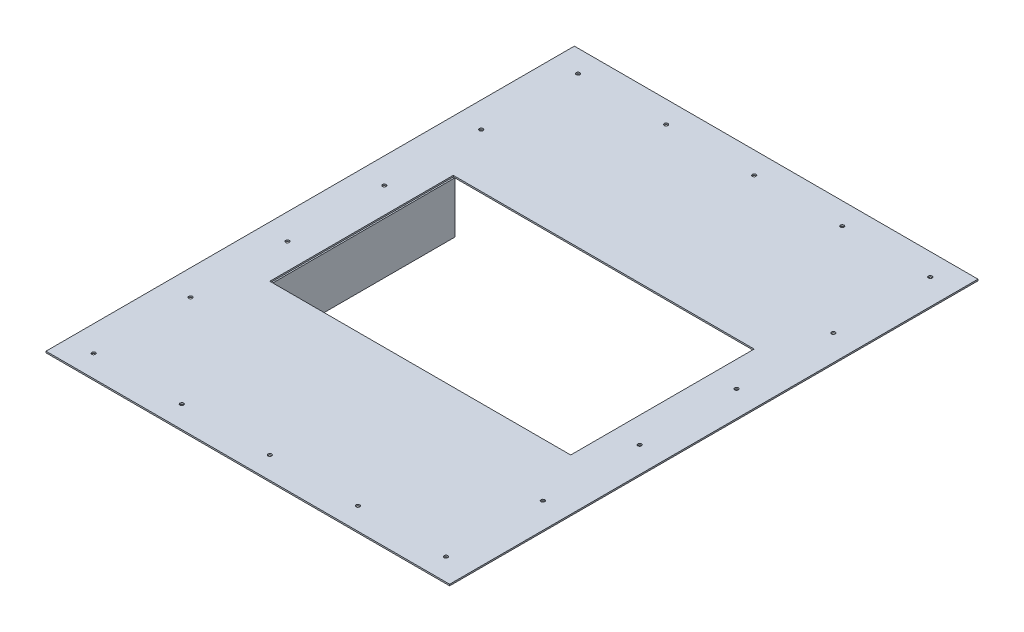
ISO-10303-21;
HEADER;
FILE_DESCRIPTION(('STEP AP214'),'2;1');
FILE_NAME('part.step','',(''),(''),'','','');
FILE_SCHEMA(('AUTOMOTIVE_DESIGN { 1 0 10303 214 1 1 1 1 }'));
ENDSEC;
DATA;
#1=APPLICATION_CONTEXT('core data for automotive mechanical design processes');
#2=APPLICATION_PROTOCOL_DEFINITION('international standard','automotive_design',2000,#1);
#3=PRODUCT_CONTEXT('',#1,'mechanical');
#4=PRODUCT('Part','Part','',(#3));
#5=PRODUCT_RELATED_PRODUCT_CATEGORY('part','',(#4));
#6=PRODUCT_DEFINITION_FORMATION('','',#4);
#7=PRODUCT_DEFINITION_CONTEXT('part definition',#1,'design');
#8=PRODUCT_DEFINITION('design','',#6,#7);
#9=PRODUCT_DEFINITION_SHAPE('','',#8);
#10=(LENGTH_UNIT() NAMED_UNIT(*) SI_UNIT(.MILLI.,.METRE.));
#11=(NAMED_UNIT(*) PLANE_ANGLE_UNIT() SI_UNIT($,.RADIAN.));
#12=(NAMED_UNIT(*) SI_UNIT($,.STERADIAN.) SOLID_ANGLE_UNIT());
#13=UNCERTAINTY_MEASURE_WITH_UNIT(LENGTH_MEASURE(1.E-05),#10,'distance_accuracy_value','');
#14=(GEOMETRIC_REPRESENTATION_CONTEXT(3) GLOBAL_UNCERTAINTY_ASSIGNED_CONTEXT((#13)) GLOBAL_UNIT_ASSIGNED_CONTEXT((#10,
#11,#12)) REPRESENTATION_CONTEXT('',''));
#15=CARTESIAN_POINT('',(0.,0.,0.));
#16=DIRECTION('',(0.,0.,1.));
#17=DIRECTION('',(1.,0.,0.));
#18=AXIS2_PLACEMENT_3D('',#15,#16,#17);
#19=CARTESIAN_POINT('',(478.,0.,235.));
#20=DIRECTION('',(0.,0.,1.));
#21=DIRECTION('',(1.,0.,0.));
#22=AXIS2_PLACEMENT_3D('',#19,#20,#21);
#23=PLANE('',#22);
#24=DIRECTION('',(0.,-1.,0.));
#25=VECTOR('',#24,1.);
#26=CARTESIAN_POINT('',(480.,0.,235.));
#27=LINE('',#26,#25);
#28=CARTESIAN_POINT('',(480.,0.,235.));
#29=VERTEX_POINT('',#28);
#30=CARTESIAN_POINT('',(480.,-70.,235.));
#31=VERTEX_POINT('',#30);
#32=EDGE_CURVE('E105',#29,#31,#27,.T.);
#33=ORIENTED_EDGE('',*,*,#32,.T.);
#34=DIRECTION('',(1.,0.,0.));
#35=VECTOR('',#34,1.);
#36=CARTESIAN_POINT('',(478.,-70.,235.));
#37=LINE('',#36,#35);
#38=CARTESIAN_POINT('',(478.,-70.,235.));
#39=VERTEX_POINT('',#38);
#40=EDGE_CURVE('E12',#39,#31,#37,.T.);
#41=ORIENTED_EDGE('',*,*,#40,.F.);
#42=DIRECTION('',(0.,-1.,0.));
#43=VECTOR('',#42,1.);
#44=CARTESIAN_POINT('',(478.,0.,235.));
#45=LINE('',#44,#43);
#46=CARTESIAN_POINT('',(478.,0.,235.));
#47=VERTEX_POINT('',#46);
#48=EDGE_CURVE('E93',#47,#39,#45,.T.);
#49=ORIENTED_EDGE('',*,*,#48,.F.);
#50=DIRECTION('',(1.,0.,0.));
#51=VECTOR('',#50,1.);
#52=CARTESIAN_POINT('',(478.,0.,235.));
#53=LINE('',#52,#51);
#54=EDGE_CURVE('E101',#47,#29,#53,.T.);
#55=ORIENTED_EDGE('',*,*,#54,.T.);
#56=EDGE_LOOP('',(#33,#41,#49,#55));
#57=FACE_BOUND('',#56,.T.);
#58=ADVANCED_FACE('F42',(#57),#23,.F.);
#59=CARTESIAN_POINT('',(478.,-70.,235.));
#60=DIRECTION('',(0.,1.,0.));
#61=DIRECTION('',(0.,0.,1.));
#62=AXIS2_PLACEMENT_3D('',#59,#60,#61);
#63=PLANE('',#62);
#64=DIRECTION('',(0.,0.,1.));
#65=VECTOR('',#64,1.);
#66=CARTESIAN_POINT('',(480.,-70.,235.));
#67=LINE('',#66,#65);
#68=CARTESIAN_POINT('',(480.,-70.,485.));
#69=VERTEX_POINT('',#68);
#70=EDGE_CURVE('E97',#31,#69,#67,.T.);
#71=ORIENTED_EDGE('',*,*,#70,.T.);
#72=DIRECTION('',(1.,0.,0.));
#73=VECTOR('',#72,1.);
#74=CARTESIAN_POINT('',(478.,-70.,485.));
#75=LINE('',#74,#73);
#76=CARTESIAN_POINT('',(478.,-70.,485.));
#77=VERTEX_POINT('',#76);
#78=EDGE_CURVE('E50',#77,#69,#75,.T.);
#79=ORIENTED_EDGE('',*,*,#78,.F.);
#80=DIRECTION('',(0.,0.,1.));
#81=VECTOR('',#80,1.);
#82=CARTESIAN_POINT('',(478.,-70.,235.));
#83=LINE('',#82,#81);
#84=EDGE_CURVE('E88',#39,#77,#83,.T.);
#85=ORIENTED_EDGE('',*,*,#84,.F.);
#86=ORIENTED_EDGE('',*,*,#40,.T.);
#87=EDGE_LOOP('',(#71,#79,#85,#86));
#88=FACE_BOUND('',#87,.T.);
#89=ADVANCED_FACE('F96',(#88),#63,.F.);
#90=CARTESIAN_POINT('',(478.,0.,485.));
#91=DIRECTION('',(0.,0.,-1.));
#92=DIRECTION('',(-1.,0.,0.));
#93=AXIS2_PLACEMENT_3D('',#90,#91,#92);
#94=PLANE('',#93);
#95=DIRECTION('',(0.,1.,0.));
#96=VECTOR('',#95,1.);
#97=CARTESIAN_POINT('',(480.,0.,485.));
#98=LINE('',#97,#96);
#99=CARTESIAN_POINT('',(480.,0.,485.));
#100=VERTEX_POINT('',#99);
#101=EDGE_CURVE('E75',#69,#100,#98,.T.);
#102=ORIENTED_EDGE('',*,*,#101,.T.);
#103=DIRECTION('',(1.,0.,0.));
#104=VECTOR('',#103,1.);
#105=CARTESIAN_POINT('',(478.,0.,485.));
#106=LINE('',#105,#104);
#107=CARTESIAN_POINT('',(478.,0.,485.));
#108=VERTEX_POINT('',#107);
#109=EDGE_CURVE('E98',#108,#100,#106,.T.);
#110=ORIENTED_EDGE('',*,*,#109,.F.);
#111=DIRECTION('',(0.,1.,0.));
#112=VECTOR('',#111,1.);
#113=CARTESIAN_POINT('',(478.,0.,485.));
#114=LINE('',#113,#112);
#115=EDGE_CURVE('E91',#77,#108,#114,.T.);
#116=ORIENTED_EDGE('',*,*,#115,.F.);
#117=ORIENTED_EDGE('',*,*,#78,.T.);
#118=EDGE_LOOP('',(#102,#110,#116,#117));
#119=FACE_BOUND('',#118,.T.);
#120=ADVANCED_FACE('F99',(#119),#94,.F.);
#121=CARTESIAN_POINT('',(478.,0.,235.));
#122=DIRECTION('',(0.,-1.,0.));
#123=DIRECTION('',(0.,0.,-1.));
#124=AXIS2_PLACEMENT_3D('',#121,#122,#123);
#125=PLANE('',#124);
#126=DIRECTION('',(0.,0.,-1.));
#127=VECTOR('',#126,1.);
#128=CARTESIAN_POINT('',(480.,0.,235.));
#129=LINE('',#128,#127);
#130=EDGE_CURVE('E81',#100,#29,#129,.T.);
#131=ORIENTED_EDGE('',*,*,#130,.T.);
#132=ORIENTED_EDGE('',*,*,#54,.F.);
#133=DIRECTION('',(0.,0.,-1.));
#134=VECTOR('',#133,1.);
#135=CARTESIAN_POINT('',(478.,0.,235.));
#136=LINE('',#135,#134);
#137=EDGE_CURVE('E58',#108,#47,#136,.T.);
#138=ORIENTED_EDGE('',*,*,#137,.F.);
#139=ORIENTED_EDGE('',*,*,#109,.T.);
#140=EDGE_LOOP('',(#131,#132,#138,#139));
#141=FACE_BOUND('',#140,.T.);
#142=ADVANCED_FACE('F112',(#141),#125,.F.);
#143=CARTESIAN_POINT('',(478.,-70.,235.));
#144=DIRECTION('',(-1.,0.,0.));
#145=DIRECTION('',(0.,0.,1.));
#146=AXIS2_PLACEMENT_3D('',#143,#144,#145);
#147=PLANE('',#146);
#148=ORIENTED_EDGE('',*,*,#48,.T.);
#149=ORIENTED_EDGE('',*,*,#84,.T.);
#150=ORIENTED_EDGE('',*,*,#115,.T.);
#151=ORIENTED_EDGE('',*,*,#137,.T.);
#152=EDGE_LOOP('',(#148,#149,#150,#151));
#153=FACE_BOUND('',#152,.T.);
#154=ADVANCED_FACE('F89',(#153),#147,.T.);
#155=CARTESIAN_POINT('',(480.,-70.,235.));
#156=DIRECTION('',(-1.,0.,0.));
#157=DIRECTION('',(0.,0.,1.));
#158=AXIS2_PLACEMENT_3D('',#155,#156,#157);
#159=PLANE('',#158);
#160=ORIENTED_EDGE('',*,*,#32,.F.);
#161=ORIENTED_EDGE('',*,*,#130,.F.);
#162=ORIENTED_EDGE('',*,*,#101,.F.);
#163=ORIENTED_EDGE('',*,*,#70,.F.);
#164=EDGE_LOOP('',(#160,#161,#162,#163));
#165=FACE_BOUND('',#164,.T.);
#166=ADVANCED_FACE('F115',(#165),#159,.F.);
#167=CLOSED_SHELL('',(#58,#89,#120,#142,#154,#166));
#168=MANIFOLD_SOLID_BREP('B2',#167);
#169=CARTESIAN_POINT('',(72.0000000000001,0.,485.));
#170=DIRECTION('',(0.,0.,-1.));
#171=DIRECTION('',(-1.,0.,0.));
#172=AXIS2_PLACEMENT_3D('',#169,#170,#171);
#173=PLANE('',#172);
#174=DIRECTION('',(0.,-1.,0.));
#175=VECTOR('',#174,1.);
#176=CARTESIAN_POINT('',(70.0000000000001,0.,485.));
#177=LINE('',#176,#175);
#178=CARTESIAN_POINT('',(70.0000000000001,0.,485.));
#179=VERTEX_POINT('',#178);
#180=CARTESIAN_POINT('',(70.0000000000001,-70.,485.));
#181=VERTEX_POINT('',#180);
#182=EDGE_CURVE('E238',#179,#181,#177,.T.);
#183=ORIENTED_EDGE('',*,*,#182,.T.);
#184=DIRECTION('',(-1.,0.,0.));
#185=VECTOR('',#184,1.);
#186=CARTESIAN_POINT('',(72.0000000000001,-70.,485.));
#187=LINE('',#186,#185);
#188=CARTESIAN_POINT('',(72.0000000000001,-70.,485.));
#189=VERTEX_POINT('',#188);
#190=EDGE_CURVE('E40',#189,#181,#187,.T.);
#191=ORIENTED_EDGE('',*,*,#190,.F.);
#192=DIRECTION('',(0.,-1.,0.));
#193=VECTOR('',#192,1.);
#194=CARTESIAN_POINT('',(72.0000000000001,0.,485.));
#195=LINE('',#194,#193);
#196=CARTESIAN_POINT('',(72.0000000000001,0.,485.));
#197=VERTEX_POINT('',#196);
#198=EDGE_CURVE('E226',#197,#189,#195,.T.);
#199=ORIENTED_EDGE('',*,*,#198,.F.);
#200=DIRECTION('',(-1.,0.,0.));
#201=VECTOR('',#200,1.);
#202=CARTESIAN_POINT('',(72.0000000000001,0.,485.));
#203=LINE('',#202,#201);
#204=EDGE_CURVE('E234',#197,#179,#203,.T.);
#205=ORIENTED_EDGE('',*,*,#204,.T.);
#206=EDGE_LOOP('',(#183,#191,#199,#205));
#207=FACE_BOUND('',#206,.T.);
#208=ADVANCED_FACE('F175',(#207),#173,.F.);
#209=CARTESIAN_POINT('',(72.0000000000001,-70.,485.));
#210=DIRECTION('',(0.,1.,0.));
#211=DIRECTION('',(0.,0.,1.));
#212=AXIS2_PLACEMENT_3D('',#209,#210,#211);
#213=PLANE('',#212);
#214=DIRECTION('',(0.,0.,-1.));
#215=VECTOR('',#214,1.);
#216=CARTESIAN_POINT('',(70.0000000000001,-70.,485.));
#217=LINE('',#216,#215);
#218=CARTESIAN_POINT('',(70.,-70.,235.));
#219=VERTEX_POINT('',#218);
#220=EDGE_CURVE('E230',#181,#219,#217,.T.);
#221=ORIENTED_EDGE('',*,*,#220,.T.);
#222=DIRECTION('',(-1.,0.,0.));
#223=VECTOR('',#222,1.);
#224=CARTESIAN_POINT('',(72.0000000000001,-70.,235.));
#225=LINE('',#224,#223);
#226=CARTESIAN_POINT('',(72.0000000000001,-70.,235.));
#227=VERTEX_POINT('',#226);
#228=EDGE_CURVE('E183',#227,#219,#225,.T.);
#229=ORIENTED_EDGE('',*,*,#228,.F.);
#230=DIRECTION('',(0.,0.,-1.));
#231=VECTOR('',#230,1.);
#232=CARTESIAN_POINT('',(72.0000000000001,-70.,485.));
#233=LINE('',#232,#231);
#234=EDGE_CURVE('E221',#189,#227,#233,.T.);
#235=ORIENTED_EDGE('',*,*,#234,.F.);
#236=ORIENTED_EDGE('',*,*,#190,.T.);
#237=EDGE_LOOP('',(#221,#229,#235,#236));
#238=FACE_BOUND('',#237,.T.);
#239=ADVANCED_FACE('F229',(#238),#213,.F.);
#240=CARTESIAN_POINT('',(72.0000000000001,0.,235.));
#241=DIRECTION('',(0.,0.,1.));
#242=DIRECTION('',(1.,0.,0.));
#243=AXIS2_PLACEMENT_3D('',#240,#241,#242);
#244=PLANE('',#243);
#245=DIRECTION('',(0.,1.,0.));
#246=VECTOR('',#245,1.);
#247=CARTESIAN_POINT('',(70.,0.,235.));
#248=LINE('',#247,#246);
#249=CARTESIAN_POINT('',(70.,0.,235.));
#250=VERTEX_POINT('',#249);
#251=EDGE_CURVE('E208',#219,#250,#248,.T.);
#252=ORIENTED_EDGE('',*,*,#251,.T.);
#253=DIRECTION('',(-1.,0.,0.));
#254=VECTOR('',#253,1.);
#255=CARTESIAN_POINT('',(72.0000000000001,0.,235.));
#256=LINE('',#255,#254);
#257=CARTESIAN_POINT('',(72.0000000000001,0.,235.));
#258=VERTEX_POINT('',#257);
#259=EDGE_CURVE('E231',#258,#250,#256,.T.);
#260=ORIENTED_EDGE('',*,*,#259,.F.);
#261=DIRECTION('',(0.,1.,0.));
#262=VECTOR('',#261,1.);
#263=CARTESIAN_POINT('',(72.0000000000001,0.,235.));
#264=LINE('',#263,#262);
#265=EDGE_CURVE('E224',#227,#258,#264,.T.);
#266=ORIENTED_EDGE('',*,*,#265,.F.);
#267=ORIENTED_EDGE('',*,*,#228,.T.);
#268=EDGE_LOOP('',(#252,#260,#266,#267));
#269=FACE_BOUND('',#268,.T.);
#270=ADVANCED_FACE('F232',(#269),#244,.F.);
#271=CARTESIAN_POINT('',(72.0000000000001,0.,485.));
#272=DIRECTION('',(0.,-1.,0.));
#273=DIRECTION('',(0.,0.,-1.));
#274=AXIS2_PLACEMENT_3D('',#271,#272,#273);
#275=PLANE('',#274);
#276=DIRECTION('',(0.,0.,1.));
#277=VECTOR('',#276,1.);
#278=CARTESIAN_POINT('',(70.0000000000001,0.,485.));
#279=LINE('',#278,#277);
#280=EDGE_CURVE('E214',#250,#179,#279,.T.);
#281=ORIENTED_EDGE('',*,*,#280,.T.);
#282=ORIENTED_EDGE('',*,*,#204,.F.);
#283=DIRECTION('',(0.,0.,1.));
#284=VECTOR('',#283,1.);
#285=CARTESIAN_POINT('',(72.0000000000001,0.,485.));
#286=LINE('',#285,#284);
#287=EDGE_CURVE('E191',#258,#197,#286,.T.);
#288=ORIENTED_EDGE('',*,*,#287,.F.);
#289=ORIENTED_EDGE('',*,*,#259,.T.);
#290=EDGE_LOOP('',(#281,#282,#288,#289));
#291=FACE_BOUND('',#290,.T.);
#292=ADVANCED_FACE('F245',(#291),#275,.F.);
#293=CARTESIAN_POINT('',(72.0000000000001,-70.,485.));
#294=DIRECTION('',(1.,0.,0.));
#295=DIRECTION('',(0.,0.,-1.));
#296=AXIS2_PLACEMENT_3D('',#293,#294,#295);
#297=PLANE('',#296);
#298=ORIENTED_EDGE('',*,*,#198,.T.);
#299=ORIENTED_EDGE('',*,*,#234,.T.);
#300=ORIENTED_EDGE('',*,*,#265,.T.);
#301=ORIENTED_EDGE('',*,*,#287,.T.);
#302=EDGE_LOOP('',(#298,#299,#300,#301));
#303=FACE_BOUND('',#302,.T.);
#304=ADVANCED_FACE('F222',(#303),#297,.T.);
#305=CARTESIAN_POINT('',(70.0000000000001,-70.,485.));
#306=DIRECTION('',(1.,0.,0.));
#307=DIRECTION('',(0.,0.,-1.));
#308=AXIS2_PLACEMENT_3D('',#305,#306,#307);
#309=PLANE('',#308);
#310=ORIENTED_EDGE('',*,*,#182,.F.);
#311=ORIENTED_EDGE('',*,*,#280,.F.);
#312=ORIENTED_EDGE('',*,*,#251,.F.);
#313=ORIENTED_EDGE('',*,*,#220,.F.);
#314=EDGE_LOOP('',(#310,#311,#312,#313));
#315=FACE_BOUND('',#314,.T.);
#316=ADVANCED_FACE('F248',(#315),#309,.F.);
#317=CLOSED_SHELL('',(#208,#239,#270,#292,#304,#316));
#318=MANIFOLD_SOLID_BREP('B6',#317);
#319=CARTESIAN_POINT('',(0.,2.,720.));
#320=DIRECTION('',(0.,1.,0.));
#321=DIRECTION('',(0.,0.,1.));
#322=AXIS2_PLACEMENT_3D('',#319,#320,#321);
#323=PLANE('',#322);
#324=CARTESIAN_POINT('',(515.,2.,162.));
#325=DIRECTION('',(0.,1.,0.));
#326=DIRECTION('',(0.,0.,1.));
#327=AXIS2_PLACEMENT_3D('',#324,#325,#326);
#328=CIRCLE('',#327,2.49999999999991);
#329=CARTESIAN_POINT('',(515.,2.,164.5));
#330=VERTEX_POINT('',#329);
#331=EDGE_CURVE('E568',#330,#330,#328,.T.);
#332=ORIENTED_EDGE('',*,*,#331,.F.);
#333=EDGE_LOOP('',(#332));
#334=FACE_BOUND('',#333,.T.);
#335=CARTESIAN_POINT('',(515.,2.,426.));
#336=DIRECTION('',(0.,1.,0.));
#337=DIRECTION('',(0.,0.,1.));
#338=AXIS2_PLACEMENT_3D('',#335,#336,#337);
#339=CIRCLE('',#338,2.49999999999992);
#340=CARTESIAN_POINT('',(515.,2.,428.5));
#341=VERTEX_POINT('',#340);
#342=EDGE_CURVE('E580',#341,#341,#339,.T.);
#343=ORIENTED_EDGE('',*,*,#342,.F.);
#344=EDGE_LOOP('',(#343));
#345=FACE_BOUND('',#344,.T.);
#346=CARTESIAN_POINT('',(515.,2.,690.));
#347=DIRECTION('',(0.,1.,0.));
#348=DIRECTION('',(0.,0.,1.));
#349=AXIS2_PLACEMENT_3D('',#346,#347,#348);
#350=CIRCLE('',#349,2.49999999999992);
#351=CARTESIAN_POINT('',(515.,2.,692.5));
#352=VERTEX_POINT('',#351);
#353=EDGE_CURVE('E592',#352,#352,#350,.T.);
#354=ORIENTED_EDGE('',*,*,#353,.F.);
#355=EDGE_LOOP('',(#354));
#356=FACE_BOUND('',#355,.T.);
#357=CARTESIAN_POINT('',(275.,2.,690.));
#358=DIRECTION('',(0.,1.,0.));
#359=DIRECTION('',(0.,0.,1.));
#360=AXIS2_PLACEMENT_3D('',#357,#358,#359);
#361=CIRCLE('',#360,2.50000000000002);
#362=CARTESIAN_POINT('',(275.,2.,692.5));
#363=VERTEX_POINT('',#362);
#364=EDGE_CURVE('E604',#363,#363,#361,.T.);
#365=ORIENTED_EDGE('',*,*,#364,.F.);
#366=EDGE_LOOP('',(#365));
#367=FACE_BOUND('',#366,.T.);
#368=CARTESIAN_POINT('',(395.,2.,30.));
#369=DIRECTION('',(0.,1.,0.));
#370=DIRECTION('',(0.,0.,1.));
#371=AXIS2_PLACEMENT_3D('',#368,#369,#370);
#372=CIRCLE('',#371,2.50000000000002);
#373=CARTESIAN_POINT('',(395.,2.,32.5));
#374=VERTEX_POINT('',#373);
#375=EDGE_CURVE('E616',#374,#374,#372,.T.);
#376=ORIENTED_EDGE('',*,*,#375,.F.);
#377=EDGE_LOOP('',(#376));
#378=FACE_BOUND('',#377,.T.);
#379=CARTESIAN_POINT('',(275.,2.,30.));
#380=DIRECTION('',(0.,1.,0.));
#381=DIRECTION('',(0.,0.,1.));
#382=AXIS2_PLACEMENT_3D('',#379,#380,#381);
#383=CIRCLE('',#382,2.50000000000002);
#384=CARTESIAN_POINT('',(275.,2.,32.5));
#385=VERTEX_POINT('',#384);
#386=EDGE_CURVE('E628',#385,#385,#383,.T.);
#387=ORIENTED_EDGE('',*,*,#386,.F.);
#388=EDGE_LOOP('',(#387));
#389=FACE_BOUND('',#388,.T.);
#390=CARTESIAN_POINT('',(35.0000000000001,2.,558.));
#391=DIRECTION('',(0.,1.,0.));
#392=DIRECTION('',(0.,0.,1.));
#393=AXIS2_PLACEMENT_3D('',#390,#391,#392);
#394=CIRCLE('',#393,2.5);
#395=CARTESIAN_POINT('',(35.0000000000001,2.,560.5));
#396=VERTEX_POINT('',#395);
#397=EDGE_CURVE('E640',#396,#396,#394,.T.);
#398=ORIENTED_EDGE('',*,*,#397,.F.);
#399=EDGE_LOOP('',(#398));
#400=FACE_BOUND('',#399,.T.);
#401=CARTESIAN_POINT('',(35.,2.,294.));
#402=DIRECTION('',(0.,1.,0.));
#403=DIRECTION('',(0.,0.,1.));
#404=AXIS2_PLACEMENT_3D('',#401,#402,#403);
#405=CIRCLE('',#404,2.5);
#406=CARTESIAN_POINT('',(35.,2.,296.5));
#407=VERTEX_POINT('',#406);
#408=EDGE_CURVE('E652',#407,#407,#405,.T.);
#409=ORIENTED_EDGE('',*,*,#408,.F.);
#410=EDGE_LOOP('',(#409));
#411=FACE_BOUND('',#410,.T.);
#412=CARTESIAN_POINT('',(35.,2.,30.));
#413=DIRECTION('',(0.,1.,0.));
#414=DIRECTION('',(0.,0.,1.));
#415=AXIS2_PLACEMENT_3D('',#412,#413,#414);
#416=CIRCLE('',#415,2.5);
#417=CARTESIAN_POINT('',(35.,2.,32.5));
#418=VERTEX_POINT('',#417);
#419=EDGE_CURVE('E396',#418,#418,#416,.T.);
#420=ORIENTED_EDGE('',*,*,#419,.F.);
#421=EDGE_LOOP('',(#420));
#422=FACE_BOUND('',#421,.T.);
#423=DIRECTION('',(0.,0.,1.));
#424=VECTOR('',#423,1.);
#425=CARTESIAN_POINT('',(0.,2.,0.));
#426=LINE('',#425,#424);
#427=CARTESIAN_POINT('',(0.,2.,0.));
#428=VERTEX_POINT('',#427);
#429=CARTESIAN_POINT('',(0.,2.,720.));
#430=VERTEX_POINT('',#429);
#431=EDGE_CURVE('E404',#428,#430,#426,.T.);
#432=ORIENTED_EDGE('',*,*,#431,.T.);
#433=DIRECTION('',(1.,0.,0.));
#434=VECTOR('',#433,1.);
#435=CARTESIAN_POINT('',(0.,2.,720.));
#436=LINE('',#435,#434);
#437=CARTESIAN_POINT('',(550.,2.,720.));
#438=VERTEX_POINT('',#437);
#439=EDGE_CURVE('E407',#430,#438,#436,.T.);
#440=ORIENTED_EDGE('',*,*,#439,.T.);
#441=DIRECTION('',(0.,0.,-1.));
#442=VECTOR('',#441,1.);
#443=CARTESIAN_POINT('',(550.,2.,0.));
#444=LINE('',#443,#442);
#445=CARTESIAN_POINT('',(550.,2.,0.));
#446=VERTEX_POINT('',#445);
#447=EDGE_CURVE('E410',#438,#446,#444,.T.);
#448=ORIENTED_EDGE('',*,*,#447,.T.);
#449=DIRECTION('',(-1.,0.,0.));
#450=VECTOR('',#449,1.);
#451=CARTESIAN_POINT('',(0.,2.,0.));
#452=LINE('',#451,#450);
#453=EDGE_CURVE('E412',#446,#428,#452,.T.);
#454=ORIENTED_EDGE('',*,*,#453,.T.);
#455=EDGE_LOOP('',(#432,#440,#448,#454));
#456=FACE_BOUND('',#455,.T.);
#457=DIRECTION('',(1.,0.,0.));
#458=VECTOR('',#457,1.);
#459=CARTESIAN_POINT('',(70.0000000000001,2.,485.));
#460=LINE('',#459,#458);
#461=CARTESIAN_POINT('',(70.0000000000001,2.,485.));
#462=VERTEX_POINT('',#461);
#463=CARTESIAN_POINT('',(480.,2.,485.));
#464=VERTEX_POINT('',#463);
#465=EDGE_CURVE('E375',#462,#464,#460,.T.);
#466=ORIENTED_EDGE('',*,*,#465,.F.);
#467=DIRECTION('',(0.,0.,1.));
#468=VECTOR('',#467,1.);
#469=CARTESIAN_POINT('',(70.,2.,235.));
#470=LINE('',#469,#468);
#471=CARTESIAN_POINT('',(70.,2.,235.));
#472=VERTEX_POINT('',#471);
#473=EDGE_CURVE('E366',#472,#462,#470,.T.);
#474=ORIENTED_EDGE('',*,*,#473,.F.);
#475=DIRECTION('',(-1.,0.,0.));
#476=VECTOR('',#475,1.);
#477=CARTESIAN_POINT('',(70.,2.,235.));
#478=LINE('',#477,#476);
#479=CARTESIAN_POINT('',(480.,2.,235.));
#480=VERTEX_POINT('',#479);
#481=EDGE_CURVE('E389',#480,#472,#478,.T.);
#482=ORIENTED_EDGE('',*,*,#481,.F.);
#483=DIRECTION('',(0.,0.,-1.));
#484=VECTOR('',#483,1.);
#485=CARTESIAN_POINT('',(480.,2.,235.));
#486=LINE('',#485,#484);
#487=EDGE_CURVE('E387',#464,#480,#486,.T.);
#488=ORIENTED_EDGE('',*,*,#487,.F.);
#489=EDGE_LOOP('',(#466,#474,#482,#488));
#490=FACE_BOUND('',#489,.T.);
#491=CARTESIAN_POINT('',(35.,2.,162.));
#492=DIRECTION('',(0.,1.,0.));
#493=DIRECTION('',(0.,0.,1.));
#494=AXIS2_PLACEMENT_3D('',#491,#492,#493);
#495=CIRCLE('',#494,2.5);
#496=CARTESIAN_POINT('',(35.,2.,164.5));
#497=VERTEX_POINT('',#496);
#498=EDGE_CURVE('E658',#497,#497,#495,.T.);
#499=ORIENTED_EDGE('',*,*,#498,.F.);
#500=EDGE_LOOP('',(#499));
#501=FACE_BOUND('',#500,.T.);
#502=CARTESIAN_POINT('',(35.,2.,426.));
#503=DIRECTION('',(0.,1.,0.));
#504=DIRECTION('',(0.,0.,1.));
#505=AXIS2_PLACEMENT_3D('',#502,#503,#504);
#506=CIRCLE('',#505,2.5);
#507=CARTESIAN_POINT('',(35.,2.,428.5));
#508=VERTEX_POINT('',#507);
#509=EDGE_CURVE('E646',#508,#508,#506,.T.);
#510=ORIENTED_EDGE('',*,*,#509,.F.);
#511=EDGE_LOOP('',(#510));
#512=FACE_BOUND('',#511,.T.);
#513=CARTESIAN_POINT('',(35.0000000000001,2.,690.));
#514=DIRECTION('',(0.,1.,0.));
#515=DIRECTION('',(0.,0.,1.));
#516=AXIS2_PLACEMENT_3D('',#513,#514,#515);
#517=CIRCLE('',#516,2.5);
#518=CARTESIAN_POINT('',(35.0000000000001,2.,692.5));
#519=VERTEX_POINT('',#518);
#520=EDGE_CURVE('E634',#519,#519,#517,.T.);
#521=ORIENTED_EDGE('',*,*,#520,.F.);
#522=EDGE_LOOP('',(#521));
#523=FACE_BOUND('',#522,.T.);
#524=CARTESIAN_POINT('',(155.,2.,30.));
#525=DIRECTION('',(0.,1.,0.));
#526=DIRECTION('',(0.,0.,1.));
#527=AXIS2_PLACEMENT_3D('',#524,#525,#526);
#528=CIRCLE('',#527,2.5);
#529=CARTESIAN_POINT('',(155.,2.,32.5));
#530=VERTEX_POINT('',#529);
#531=EDGE_CURVE('E622',#530,#530,#528,.T.);
#532=ORIENTED_EDGE('',*,*,#531,.F.);
#533=EDGE_LOOP('',(#532));
#534=FACE_BOUND('',#533,.T.);
#535=CARTESIAN_POINT('',(155.,2.,690.));
#536=DIRECTION('',(0.,1.,0.));
#537=DIRECTION('',(0.,0.,1.));
#538=AXIS2_PLACEMENT_3D('',#535,#536,#537);
#539=CIRCLE('',#538,2.5);
#540=CARTESIAN_POINT('',(155.,2.,692.5));
#541=VERTEX_POINT('',#540);
#542=EDGE_CURVE('E610',#541,#541,#539,.T.);
#543=ORIENTED_EDGE('',*,*,#542,.F.);
#544=EDGE_LOOP('',(#543));
#545=FACE_BOUND('',#544,.T.);
#546=CARTESIAN_POINT('',(395.,2.,690.));
#547=DIRECTION('',(0.,1.,0.));
#548=DIRECTION('',(0.,0.,1.));
#549=AXIS2_PLACEMENT_3D('',#546,#547,#548);
#550=CIRCLE('',#549,2.50000000000002);
#551=CARTESIAN_POINT('',(395.,2.,692.5));
#552=VERTEX_POINT('',#551);
#553=EDGE_CURVE('E598',#552,#552,#550,.T.);
#554=ORIENTED_EDGE('',*,*,#553,.F.);
#555=EDGE_LOOP('',(#554));
#556=FACE_BOUND('',#555,.T.);
#557=CARTESIAN_POINT('',(515.,2.,558.));
#558=DIRECTION('',(0.,1.,0.));
#559=DIRECTION('',(0.,0.,1.));
#560=AXIS2_PLACEMENT_3D('',#557,#558,#559);
#561=CIRCLE('',#560,2.49999999999992);
#562=CARTESIAN_POINT('',(515.,2.,560.5));
#563=VERTEX_POINT('',#562);
#564=EDGE_CURVE('E586',#563,#563,#561,.T.);
#565=ORIENTED_EDGE('',*,*,#564,.F.);
#566=EDGE_LOOP('',(#565));
#567=FACE_BOUND('',#566,.T.);
#568=CARTESIAN_POINT('',(515.,2.,294.));
#569=DIRECTION('',(0.,1.,0.));
#570=DIRECTION('',(0.,0.,1.));
#571=AXIS2_PLACEMENT_3D('',#568,#569,#570);
#572=CIRCLE('',#571,2.49999999999992);
#573=CARTESIAN_POINT('',(515.,2.,296.5));
#574=VERTEX_POINT('',#573);
#575=EDGE_CURVE('E574',#574,#574,#572,.T.);
#576=ORIENTED_EDGE('',*,*,#575,.F.);
#577=EDGE_LOOP('',(#576));
#578=FACE_BOUND('',#577,.T.);
#579=CARTESIAN_POINT('',(515.,2.,30.));
#580=DIRECTION('',(0.,1.,0.));
#581=DIRECTION('',(0.,0.,1.));
#582=AXIS2_PLACEMENT_3D('',#579,#580,#581);
#583=CIRCLE('',#582,2.49999999999991);
#584=CARTESIAN_POINT('',(515.,2.,32.4999999999999));
#585=VERTEX_POINT('',#584);
#586=EDGE_CURVE('E559',#585,#585,#583,.T.);
#587=ORIENTED_EDGE('',*,*,#586,.F.);
#588=EDGE_LOOP('',(#587));
#589=FACE_BOUND('',#588,.T.);
#590=ADVANCED_FACE('F299',(#334,#345,#356,#367,#378,#389,#400,#411,#422,#456,#490,#501,#512,
#523,#534,#545,#556,#567,#578,#589),#323,.T.);
#591=CARTESIAN_POINT('',(0.,0.,720.));
#592=DIRECTION('',(0.,1.,0.));
#593=DIRECTION('',(0.,0.,1.));
#594=AXIS2_PLACEMENT_3D('',#591,#592,#593);
#595=PLANE('',#594);
#596=CARTESIAN_POINT('',(515.,0.,162.));
#597=DIRECTION('',(0.,1.,0.));
#598=DIRECTION('',(0.,0.,1.));
#599=AXIS2_PLACEMENT_3D('',#596,#597,#598);
#600=CIRCLE('',#599,2.49999999999991);
#601=CARTESIAN_POINT('',(515.,0.,164.5));
#602=VERTEX_POINT('',#601);
#603=EDGE_CURVE('E565',#602,#602,#600,.T.);
#604=ORIENTED_EDGE('',*,*,#603,.T.);
#605=EDGE_LOOP('',(#604));
#606=FACE_BOUND('',#605,.T.);
#607=CARTESIAN_POINT('',(515.,0.,426.));
#608=DIRECTION('',(0.,1.,0.));
#609=DIRECTION('',(0.,0.,1.));
#610=AXIS2_PLACEMENT_3D('',#607,#608,#609);
#611=CIRCLE('',#610,2.49999999999992);
#612=CARTESIAN_POINT('',(515.,0.,428.5));
#613=VERTEX_POINT('',#612);
#614=EDGE_CURVE('E577',#613,#613,#611,.T.);
#615=ORIENTED_EDGE('',*,*,#614,.T.);
#616=EDGE_LOOP('',(#615));
#617=FACE_BOUND('',#616,.T.);
#618=CARTESIAN_POINT('',(515.,0.,690.));
#619=DIRECTION('',(0.,1.,0.));
#620=DIRECTION('',(0.,0.,1.));
#621=AXIS2_PLACEMENT_3D('',#618,#619,#620);
#622=CIRCLE('',#621,2.49999999999992);
#623=CARTESIAN_POINT('',(515.,0.,692.5));
#624=VERTEX_POINT('',#623);
#625=EDGE_CURVE('E589',#624,#624,#622,.T.);
#626=ORIENTED_EDGE('',*,*,#625,.T.);
#627=EDGE_LOOP('',(#626));
#628=FACE_BOUND('',#627,.T.);
#629=CARTESIAN_POINT('',(275.,0.,690.));
#630=DIRECTION('',(0.,1.,0.));
#631=DIRECTION('',(0.,0.,1.));
#632=AXIS2_PLACEMENT_3D('',#629,#630,#631);
#633=CIRCLE('',#632,2.50000000000002);
#634=CARTESIAN_POINT('',(275.,0.,692.5));
#635=VERTEX_POINT('',#634);
#636=EDGE_CURVE('E601',#635,#635,#633,.T.);
#637=ORIENTED_EDGE('',*,*,#636,.T.);
#638=EDGE_LOOP('',(#637));
#639=FACE_BOUND('',#638,.T.);
#640=CARTESIAN_POINT('',(395.,0.,30.));
#641=DIRECTION('',(0.,1.,0.));
#642=DIRECTION('',(0.,0.,1.));
#643=AXIS2_PLACEMENT_3D('',#640,#641,#642);
#644=CIRCLE('',#643,2.50000000000002);
#645=CARTESIAN_POINT('',(395.,0.,32.5));
#646=VERTEX_POINT('',#645);
#647=EDGE_CURVE('E613',#646,#646,#644,.T.);
#648=ORIENTED_EDGE('',*,*,#647,.T.);
#649=EDGE_LOOP('',(#648));
#650=FACE_BOUND('',#649,.T.);
#651=CARTESIAN_POINT('',(275.,0.,30.));
#652=DIRECTION('',(0.,1.,0.));
#653=DIRECTION('',(0.,0.,1.));
#654=AXIS2_PLACEMENT_3D('',#651,#652,#653);
#655=CIRCLE('',#654,2.50000000000002);
#656=CARTESIAN_POINT('',(275.,0.,32.5));
#657=VERTEX_POINT('',#656);
#658=EDGE_CURVE('E625',#657,#657,#655,.T.);
#659=ORIENTED_EDGE('',*,*,#658,.T.);
#660=EDGE_LOOP('',(#659));
#661=FACE_BOUND('',#660,.T.);
#662=CARTESIAN_POINT('',(35.0000000000001,0.,558.));
#663=DIRECTION('',(0.,1.,0.));
#664=DIRECTION('',(0.,0.,1.));
#665=AXIS2_PLACEMENT_3D('',#662,#663,#664);
#666=CIRCLE('',#665,2.5);
#667=CARTESIAN_POINT('',(35.0000000000001,0.,560.5));
#668=VERTEX_POINT('',#667);
#669=EDGE_CURVE('E637',#668,#668,#666,.T.);
#670=ORIENTED_EDGE('',*,*,#669,.T.);
#671=EDGE_LOOP('',(#670));
#672=FACE_BOUND('',#671,.T.);
#673=CARTESIAN_POINT('',(35.,0.,294.));
#674=DIRECTION('',(0.,1.,0.));
#675=DIRECTION('',(0.,0.,1.));
#676=AXIS2_PLACEMENT_3D('',#673,#674,#675);
#677=CIRCLE('',#676,2.5);
#678=CARTESIAN_POINT('',(35.,0.,296.5));
#679=VERTEX_POINT('',#678);
#680=EDGE_CURVE('E649',#679,#679,#677,.T.);
#681=ORIENTED_EDGE('',*,*,#680,.T.);
#682=EDGE_LOOP('',(#681));
#683=FACE_BOUND('',#682,.T.);
#684=CARTESIAN_POINT('',(35.,0.,30.));
#685=DIRECTION('',(0.,1.,0.));
#686=DIRECTION('',(0.,0.,1.));
#687=AXIS2_PLACEMENT_3D('',#684,#685,#686);
#688=CIRCLE('',#687,2.5);
#689=CARTESIAN_POINT('',(35.,0.,32.5));
#690=VERTEX_POINT('',#689);
#691=EDGE_CURVE('E661',#690,#690,#688,.T.);
#692=ORIENTED_EDGE('',*,*,#691,.T.);
#693=EDGE_LOOP('',(#692));
#694=FACE_BOUND('',#693,.T.);
#695=DIRECTION('',(0.,0.,1.));
#696=VECTOR('',#695,1.);
#697=CARTESIAN_POINT('',(0.,0.,0.));
#698=LINE('',#697,#696);
#699=CARTESIAN_POINT('',(0.,0.,0.));
#700=VERTEX_POINT('',#699);
#701=CARTESIAN_POINT('',(0.,0.,720.));
#702=VERTEX_POINT('',#701);
#703=EDGE_CURVE('E382',#700,#702,#698,.T.);
#704=ORIENTED_EDGE('',*,*,#703,.F.);
#705=DIRECTION('',(-1.,0.,0.));
#706=VECTOR('',#705,1.);
#707=CARTESIAN_POINT('',(0.,0.,0.));
#708=LINE('',#707,#706);
#709=CARTESIAN_POINT('',(550.,0.,0.));
#710=VERTEX_POINT('',#709);
#711=EDGE_CURVE('E408',#710,#700,#708,.T.);
#712=ORIENTED_EDGE('',*,*,#711,.F.);
#713=DIRECTION('',(0.,0.,-1.));
#714=VECTOR('',#713,1.);
#715=CARTESIAN_POINT('',(550.,0.,0.));
#716=LINE('',#715,#714);
#717=CARTESIAN_POINT('',(550.,0.,720.));
#718=VERTEX_POINT('',#717);
#719=EDGE_CURVE('E419',#718,#710,#716,.T.);
#720=ORIENTED_EDGE('',*,*,#719,.F.);
#721=DIRECTION('',(1.,0.,0.));
#722=VECTOR('',#721,1.);
#723=CARTESIAN_POINT('',(0.,0.,720.));
#724=LINE('',#723,#722);
#725=EDGE_CURVE('E417',#702,#718,#724,.T.);
#726=ORIENTED_EDGE('',*,*,#725,.F.);
#727=EDGE_LOOP('',(#704,#712,#720,#726));
#728=FACE_BOUND('',#727,.T.);
#729=DIRECTION('',(0.,0.,1.));
#730=VECTOR('',#729,1.);
#731=CARTESIAN_POINT('',(70.,0.,235.));
#732=LINE('',#731,#730);
#733=CARTESIAN_POINT('',(70.,0.,235.));
#734=VERTEX_POINT('',#733);
#735=CARTESIAN_POINT('',(70.0000000000001,0.,485.));
#736=VERTEX_POINT('',#735);
#737=EDGE_CURVE('E394',#734,#736,#732,.T.);
#738=ORIENTED_EDGE('',*,*,#737,.T.);
#739=DIRECTION('',(1.,0.,0.));
#740=VECTOR('',#739,1.);
#741=CARTESIAN_POINT('',(70.0000000000001,0.,485.));
#742=LINE('',#741,#740);
#743=CARTESIAN_POINT('',(480.,0.,485.));
#744=VERTEX_POINT('',#743);
#745=EDGE_CURVE('E381',#736,#744,#742,.T.);
#746=ORIENTED_EDGE('',*,*,#745,.T.);
#747=DIRECTION('',(0.,0.,-1.));
#748=VECTOR('',#747,1.);
#749=CARTESIAN_POINT('',(480.,0.,235.));
#750=LINE('',#749,#748);
#751=CARTESIAN_POINT('',(480.,0.,235.));
#752=VERTEX_POINT('',#751);
#753=EDGE_CURVE('E398',#744,#752,#750,.T.);
#754=ORIENTED_EDGE('',*,*,#753,.T.);
#755=DIRECTION('',(-1.,0.,0.));
#756=VECTOR('',#755,1.);
#757=CARTESIAN_POINT('',(70.,0.,235.));
#758=LINE('',#757,#756);
#759=EDGE_CURVE('E321',#752,#734,#758,.T.);
#760=ORIENTED_EDGE('',*,*,#759,.T.);
#761=EDGE_LOOP('',(#738,#746,#754,#760));
#762=FACE_BOUND('',#761,.T.);
#763=CARTESIAN_POINT('',(35.,0.,162.));
#764=DIRECTION('',(0.,1.,0.));
#765=DIRECTION('',(0.,0.,1.));
#766=AXIS2_PLACEMENT_3D('',#763,#764,#765);
#767=CIRCLE('',#766,2.5);
#768=CARTESIAN_POINT('',(35.,0.,164.5));
#769=VERTEX_POINT('',#768);
#770=EDGE_CURVE('E655',#769,#769,#767,.T.);
#771=ORIENTED_EDGE('',*,*,#770,.T.);
#772=EDGE_LOOP('',(#771));
#773=FACE_BOUND('',#772,.T.);
#774=CARTESIAN_POINT('',(35.,0.,426.));
#775=DIRECTION('',(0.,1.,0.));
#776=DIRECTION('',(0.,0.,1.));
#777=AXIS2_PLACEMENT_3D('',#774,#775,#776);
#778=CIRCLE('',#777,2.5);
#779=CARTESIAN_POINT('',(35.,0.,428.5));
#780=VERTEX_POINT('',#779);
#781=EDGE_CURVE('E643',#780,#780,#778,.T.);
#782=ORIENTED_EDGE('',*,*,#781,.T.);
#783=EDGE_LOOP('',(#782));
#784=FACE_BOUND('',#783,.T.);
#785=CARTESIAN_POINT('',(35.0000000000001,0.,690.));
#786=DIRECTION('',(0.,1.,0.));
#787=DIRECTION('',(0.,0.,1.));
#788=AXIS2_PLACEMENT_3D('',#785,#786,#787);
#789=CIRCLE('',#788,2.5);
#790=CARTESIAN_POINT('',(35.0000000000001,0.,692.5));
#791=VERTEX_POINT('',#790);
#792=EDGE_CURVE('E631',#791,#791,#789,.T.);
#793=ORIENTED_EDGE('',*,*,#792,.T.);
#794=EDGE_LOOP('',(#793));
#795=FACE_BOUND('',#794,.T.);
#796=CARTESIAN_POINT('',(155.,0.,30.));
#797=DIRECTION('',(0.,1.,0.));
#798=DIRECTION('',(0.,0.,1.));
#799=AXIS2_PLACEMENT_3D('',#796,#797,#798);
#800=CIRCLE('',#799,2.5);
#801=CARTESIAN_POINT('',(155.,0.,32.5));
#802=VERTEX_POINT('',#801);
#803=EDGE_CURVE('E619',#802,#802,#800,.T.);
#804=ORIENTED_EDGE('',*,*,#803,.T.);
#805=EDGE_LOOP('',(#804));
#806=FACE_BOUND('',#805,.T.);
#807=CARTESIAN_POINT('',(155.,0.,690.));
#808=DIRECTION('',(0.,1.,0.));
#809=DIRECTION('',(0.,0.,1.));
#810=AXIS2_PLACEMENT_3D('',#807,#808,#809);
#811=CIRCLE('',#810,2.5);
#812=CARTESIAN_POINT('',(155.,0.,692.5));
#813=VERTEX_POINT('',#812);
#814=EDGE_CURVE('E607',#813,#813,#811,.T.);
#815=ORIENTED_EDGE('',*,*,#814,.T.);
#816=EDGE_LOOP('',(#815));
#817=FACE_BOUND('',#816,.T.);
#818=CARTESIAN_POINT('',(395.,0.,690.));
#819=DIRECTION('',(0.,1.,0.));
#820=DIRECTION('',(0.,0.,1.));
#821=AXIS2_PLACEMENT_3D('',#818,#819,#820);
#822=CIRCLE('',#821,2.50000000000002);
#823=CARTESIAN_POINT('',(395.,0.,692.5));
#824=VERTEX_POINT('',#823);
#825=EDGE_CURVE('E595',#824,#824,#822,.T.);
#826=ORIENTED_EDGE('',*,*,#825,.T.);
#827=EDGE_LOOP('',(#826));
#828=FACE_BOUND('',#827,.T.);
#829=CARTESIAN_POINT('',(515.,0.,558.));
#830=DIRECTION('',(0.,1.,0.));
#831=DIRECTION('',(0.,0.,1.));
#832=AXIS2_PLACEMENT_3D('',#829,#830,#831);
#833=CIRCLE('',#832,2.49999999999992);
#834=CARTESIAN_POINT('',(515.,0.,560.5));
#835=VERTEX_POINT('',#834);
#836=EDGE_CURVE('E583',#835,#835,#833,.T.);
#837=ORIENTED_EDGE('',*,*,#836,.T.);
#838=EDGE_LOOP('',(#837));
#839=FACE_BOUND('',#838,.T.);
#840=CARTESIAN_POINT('',(515.,0.,294.));
#841=DIRECTION('',(0.,1.,0.));
#842=DIRECTION('',(0.,0.,1.));
#843=AXIS2_PLACEMENT_3D('',#840,#841,#842);
#844=CIRCLE('',#843,2.49999999999992);
#845=CARTESIAN_POINT('',(515.,0.,296.5));
#846=VERTEX_POINT('',#845);
#847=EDGE_CURVE('E571',#846,#846,#844,.T.);
#848=ORIENTED_EDGE('',*,*,#847,.T.);
#849=EDGE_LOOP('',(#848));
#850=FACE_BOUND('',#849,.T.);
#851=CARTESIAN_POINT('',(515.,0.,30.));
#852=DIRECTION('',(0.,1.,0.));
#853=DIRECTION('',(0.,0.,1.));
#854=AXIS2_PLACEMENT_3D('',#851,#852,#853);
#855=CIRCLE('',#854,2.49999999999991);
#856=CARTESIAN_POINT('',(515.,0.,32.4999999999999));
#857=VERTEX_POINT('',#856);
#858=EDGE_CURVE('E562',#857,#857,#855,.T.);
#859=ORIENTED_EDGE('',*,*,#858,.T.);
#860=EDGE_LOOP('',(#859));
#861=FACE_BOUND('',#860,.T.);
#862=ADVANCED_FACE('F437',(#606,#617,#628,#639,#650,#661,#672,#683,#694,#728,#762,#773,#784,
#795,#806,#817,#828,#839,#850,#861),#595,.F.);
#863=CARTESIAN_POINT('',(0.,2.,0.));
#864=DIRECTION('',(1.,0.,0.));
#865=DIRECTION('',(0.,0.,-1.));
#866=AXIS2_PLACEMENT_3D('',#863,#864,#865);
#867=PLANE('',#866);
#868=ORIENTED_EDGE('',*,*,#703,.T.);
#869=DIRECTION('',(0.,-1.,0.));
#870=VECTOR('',#869,1.);
#871=CARTESIAN_POINT('',(0.,2.,720.));
#872=LINE('',#871,#870);
#873=EDGE_CURVE('E173',#430,#702,#872,.T.);
#874=ORIENTED_EDGE('',*,*,#873,.F.);
#875=ORIENTED_EDGE('',*,*,#431,.F.);
#876=DIRECTION('',(0.,-1.,0.));
#877=VECTOR('',#876,1.);
#878=CARTESIAN_POINT('',(0.,2.,0.));
#879=LINE('',#878,#877);
#880=EDGE_CURVE('E414',#428,#700,#879,.T.);
#881=ORIENTED_EDGE('',*,*,#880,.T.);
#882=EDGE_LOOP('',(#868,#874,#875,#881));
#883=FACE_BOUND('',#882,.T.);
#884=ADVANCED_FACE('F301',(#883),#867,.F.);
#885=CARTESIAN_POINT('',(0.,2.,720.));
#886=DIRECTION('',(0.,0.,-1.));
#887=DIRECTION('',(-1.,0.,0.));
#888=AXIS2_PLACEMENT_3D('',#885,#886,#887);
#889=PLANE('',#888);
#890=ORIENTED_EDGE('',*,*,#725,.T.);
#891=DIRECTION('',(0.,-1.,0.));
#892=VECTOR('',#891,1.);
#893=CARTESIAN_POINT('',(550.,2.,720.));
#894=LINE('',#893,#892);
#895=EDGE_CURVE('E307',#438,#718,#894,.T.);
#896=ORIENTED_EDGE('',*,*,#895,.F.);
#897=ORIENTED_EDGE('',*,*,#439,.F.);
#898=ORIENTED_EDGE('',*,*,#873,.T.);
#899=EDGE_LOOP('',(#890,#896,#897,#898));
#900=FACE_BOUND('',#899,.T.);
#901=ADVANCED_FACE('F446',(#900),#889,.F.);
#902=CARTESIAN_POINT('',(550.,2.,0.));
#903=DIRECTION('',(-1.,0.,0.));
#904=DIRECTION('',(0.,0.,1.));
#905=AXIS2_PLACEMENT_3D('',#902,#903,#904);
#906=PLANE('',#905);
#907=ORIENTED_EDGE('',*,*,#719,.T.);
#908=DIRECTION('',(0.,-1.,0.));
#909=VECTOR('',#908,1.);
#910=CARTESIAN_POINT('',(550.,2.,0.));
#911=LINE('',#910,#909);
#912=EDGE_CURVE('E424',#446,#710,#911,.T.);
#913=ORIENTED_EDGE('',*,*,#912,.F.);
#914=ORIENTED_EDGE('',*,*,#447,.F.);
#915=ORIENTED_EDGE('',*,*,#895,.T.);
#916=EDGE_LOOP('',(#907,#913,#914,#915));
#917=FACE_BOUND('',#916,.T.);
#918=ADVANCED_FACE('F431',(#917),#906,.F.);
#919=CARTESIAN_POINT('',(0.,2.,0.));
#920=DIRECTION('',(0.,0.,1.));
#921=DIRECTION('',(1.,0.,0.));
#922=AXIS2_PLACEMENT_3D('',#919,#920,#921);
#923=PLANE('',#922);
#924=ORIENTED_EDGE('',*,*,#711,.T.);
#925=ORIENTED_EDGE('',*,*,#880,.F.);
#926=ORIENTED_EDGE('',*,*,#453,.F.);
#927=ORIENTED_EDGE('',*,*,#912,.T.);
#928=EDGE_LOOP('',(#924,#925,#926,#927));
#929=FACE_BOUND('',#928,.T.);
#930=ADVANCED_FACE('F440',(#929),#923,.F.);
#931=CARTESIAN_POINT('',(70.,2.,235.));
#932=DIRECTION('',(1.,0.,0.));
#933=DIRECTION('',(0.,0.,-1.));
#934=AXIS2_PLACEMENT_3D('',#931,#932,#933);
#935=PLANE('',#934);
#936=ORIENTED_EDGE('',*,*,#737,.F.);
#937=DIRECTION('',(0.,-1.,0.));
#938=VECTOR('',#937,1.);
#939=CARTESIAN_POINT('',(70.,2.,235.));
#940=LINE('',#939,#938);
#941=EDGE_CURVE('E371',#472,#734,#940,.T.);
#942=ORIENTED_EDGE('',*,*,#941,.F.);
#943=ORIENTED_EDGE('',*,*,#473,.T.);
#944=DIRECTION('',(0.,-1.,0.));
#945=VECTOR('',#944,1.);
#946=CARTESIAN_POINT('',(70.0000000000001,2.,485.));
#947=LINE('',#946,#945);
#948=EDGE_CURVE('E369',#462,#736,#947,.T.);
#949=ORIENTED_EDGE('',*,*,#948,.T.);
#950=EDGE_LOOP('',(#936,#942,#943,#949));
#951=FACE_BOUND('',#950,.T.);
#952=ADVANCED_FACE('F368',(#951),#935,.T.);
#953=CARTESIAN_POINT('',(70.0000000000001,2.,485.));
#954=DIRECTION('',(0.,0.,-1.));
#955=DIRECTION('',(-1.,0.,0.));
#956=AXIS2_PLACEMENT_3D('',#953,#954,#955);
#957=PLANE('',#956);
#958=ORIENTED_EDGE('',*,*,#745,.F.);
#959=ORIENTED_EDGE('',*,*,#948,.F.);
#960=ORIENTED_EDGE('',*,*,#465,.T.);
#961=DIRECTION('',(0.,-1.,0.));
#962=VECTOR('',#961,1.);
#963=CARTESIAN_POINT('',(480.,2.,485.));
#964=LINE('',#963,#962);
#965=EDGE_CURVE('E383',#464,#744,#964,.T.);
#966=ORIENTED_EDGE('',*,*,#965,.T.);
#967=EDGE_LOOP('',(#958,#959,#960,#966));
#968=FACE_BOUND('',#967,.T.);
#969=ADVANCED_FACE('F378',(#968),#957,.T.);
#970=CARTESIAN_POINT('',(480.,2.,235.));
#971=DIRECTION('',(-1.,0.,0.));
#972=DIRECTION('',(0.,0.,1.));
#973=AXIS2_PLACEMENT_3D('',#970,#971,#972);
#974=PLANE('',#973);
#975=ORIENTED_EDGE('',*,*,#753,.F.);
#976=ORIENTED_EDGE('',*,*,#965,.F.);
#977=ORIENTED_EDGE('',*,*,#487,.T.);
#978=DIRECTION('',(0.,-1.,0.));
#979=VECTOR('',#978,1.);
#980=CARTESIAN_POINT('',(480.,2.,235.));
#981=LINE('',#980,#979);
#982=EDGE_CURVE('E314',#480,#752,#981,.T.);
#983=ORIENTED_EDGE('',*,*,#982,.T.);
#984=EDGE_LOOP('',(#975,#976,#977,#983));
#985=FACE_BOUND('',#984,.T.);
#986=ADVANCED_FACE('F473',(#985),#974,.T.);
#987=CARTESIAN_POINT('',(70.,2.,235.));
#988=DIRECTION('',(0.,0.,1.));
#989=DIRECTION('',(1.,0.,0.));
#990=AXIS2_PLACEMENT_3D('',#987,#988,#989);
#991=PLANE('',#990);
#992=ORIENTED_EDGE('',*,*,#759,.F.);
#993=ORIENTED_EDGE('',*,*,#982,.F.);
#994=ORIENTED_EDGE('',*,*,#481,.T.);
#995=ORIENTED_EDGE('',*,*,#941,.T.);
#996=EDGE_LOOP('',(#992,#993,#994,#995));
#997=FACE_BOUND('',#996,.T.);
#998=ADVANCED_FACE('F477',(#997),#991,.T.);
#999=CARTESIAN_POINT('',(35.,2.,30.));
#1000=DIRECTION('',(0.,-1.,0.));
#1001=DIRECTION('',(0.,0.,-1.));
#1002=AXIS2_PLACEMENT_3D('',#999,#1000,#1001);
#1003=CYLINDRICAL_SURFACE('',#1002,2.5);
#1004=ORIENTED_EDGE('',*,*,#419,.T.);
#1005=EDGE_LOOP('',(#1004));
#1006=FACE_BOUND('',#1005,.T.);
#1007=ORIENTED_EDGE('',*,*,#691,.F.);
#1008=EDGE_LOOP('',(#1007));
#1009=FACE_BOUND('',#1008,.T.);
#1010=ADVANCED_FACE('F483',(#1006,#1009),#1003,.F.);
#1011=CARTESIAN_POINT('',(35.,2.,162.));
#1012=DIRECTION('',(0.,-1.,0.));
#1013=DIRECTION('',(0.,0.,-1.));
#1014=AXIS2_PLACEMENT_3D('',#1011,#1012,#1013);
#1015=CYLINDRICAL_SURFACE('',#1014,2.5);
#1016=ORIENTED_EDGE('',*,*,#498,.T.);
#1017=EDGE_LOOP('',(#1016));
#1018=FACE_BOUND('',#1017,.T.);
#1019=ORIENTED_EDGE('',*,*,#770,.F.);
#1020=EDGE_LOOP('',(#1019));
#1021=FACE_BOUND('',#1020,.T.);
#1022=ADVANCED_FACE('F486',(#1018,#1021),#1015,.F.);
#1023=CARTESIAN_POINT('',(35.,2.,294.));
#1024=DIRECTION('',(0.,-1.,0.));
#1025=DIRECTION('',(0.,0.,-1.));
#1026=AXIS2_PLACEMENT_3D('',#1023,#1024,#1025);
#1027=CYLINDRICAL_SURFACE('',#1026,2.5);
#1028=ORIENTED_EDGE('',*,*,#408,.T.);
#1029=EDGE_LOOP('',(#1028));
#1030=FACE_BOUND('',#1029,.T.);
#1031=ORIENTED_EDGE('',*,*,#680,.F.);
#1032=EDGE_LOOP('',(#1031));
#1033=FACE_BOUND('',#1032,.T.);
#1034=ADVANCED_FACE('F490',(#1030,#1033),#1027,.F.);
#1035=CARTESIAN_POINT('',(35.,2.,426.));
#1036=DIRECTION('',(0.,-1.,0.));
#1037=DIRECTION('',(0.,0.,-1.));
#1038=AXIS2_PLACEMENT_3D('',#1035,#1036,#1037);
#1039=CYLINDRICAL_SURFACE('',#1038,2.5);
#1040=ORIENTED_EDGE('',*,*,#509,.T.);
#1041=EDGE_LOOP('',(#1040));
#1042=FACE_BOUND('',#1041,.T.);
#1043=ORIENTED_EDGE('',*,*,#781,.F.);
#1044=EDGE_LOOP('',(#1043));
#1045=FACE_BOUND('',#1044,.T.);
#1046=ADVANCED_FACE('F494',(#1042,#1045),#1039,.F.);
#1047=CARTESIAN_POINT('',(35.0000000000001,2.,558.));
#1048=DIRECTION('',(0.,-1.,0.));
#1049=DIRECTION('',(0.,0.,-1.));
#1050=AXIS2_PLACEMENT_3D('',#1047,#1048,#1049);
#1051=CYLINDRICAL_SURFACE('',#1050,2.5);
#1052=ORIENTED_EDGE('',*,*,#397,.T.);
#1053=EDGE_LOOP('',(#1052));
#1054=FACE_BOUND('',#1053,.T.);
#1055=ORIENTED_EDGE('',*,*,#669,.F.);
#1056=EDGE_LOOP('',(#1055));
#1057=FACE_BOUND('',#1056,.T.);
#1058=ADVANCED_FACE('F498',(#1054,#1057),#1051,.F.);
#1059=CARTESIAN_POINT('',(35.0000000000001,2.,690.));
#1060=DIRECTION('',(0.,-1.,0.));
#1061=DIRECTION('',(0.,0.,-1.));
#1062=AXIS2_PLACEMENT_3D('',#1059,#1060,#1061);
#1063=CYLINDRICAL_SURFACE('',#1062,2.5);
#1064=ORIENTED_EDGE('',*,*,#520,.T.);
#1065=EDGE_LOOP('',(#1064));
#1066=FACE_BOUND('',#1065,.T.);
#1067=ORIENTED_EDGE('',*,*,#792,.F.);
#1068=EDGE_LOOP('',(#1067));
#1069=FACE_BOUND('',#1068,.T.);
#1070=ADVANCED_FACE('F502',(#1066,#1069),#1063,.F.);
#1071=CARTESIAN_POINT('',(275.,2.,30.));
#1072=DIRECTION('',(0.,-1.,0.));
#1073=DIRECTION('',(0.,0.,-1.));
#1074=AXIS2_PLACEMENT_3D('',#1071,#1072,#1073);
#1075=CYLINDRICAL_SURFACE('',#1074,2.50000000000002);
#1076=ORIENTED_EDGE('',*,*,#386,.T.);
#1077=EDGE_LOOP('',(#1076));
#1078=FACE_BOUND('',#1077,.T.);
#1079=ORIENTED_EDGE('',*,*,#658,.F.);
#1080=EDGE_LOOP('',(#1079));
#1081=FACE_BOUND('',#1080,.T.);
#1082=ADVANCED_FACE('F506',(#1078,#1081),#1075,.F.);
#1083=CARTESIAN_POINT('',(155.,2.,30.));
#1084=DIRECTION('',(0.,-1.,0.));
#1085=DIRECTION('',(0.,0.,-1.));
#1086=AXIS2_PLACEMENT_3D('',#1083,#1084,#1085);
#1087=CYLINDRICAL_SURFACE('',#1086,2.5);
#1088=ORIENTED_EDGE('',*,*,#531,.T.);
#1089=EDGE_LOOP('',(#1088));
#1090=FACE_BOUND('',#1089,.T.);
#1091=ORIENTED_EDGE('',*,*,#803,.F.);
#1092=EDGE_LOOP('',(#1091));
#1093=FACE_BOUND('',#1092,.T.);
#1094=ADVANCED_FACE('F510',(#1090,#1093),#1087,.F.);
#1095=CARTESIAN_POINT('',(395.,2.,30.));
#1096=DIRECTION('',(0.,-1.,0.));
#1097=DIRECTION('',(0.,0.,-1.));
#1098=AXIS2_PLACEMENT_3D('',#1095,#1096,#1097);
#1099=CYLINDRICAL_SURFACE('',#1098,2.50000000000002);
#1100=ORIENTED_EDGE('',*,*,#375,.T.);
#1101=EDGE_LOOP('',(#1100));
#1102=FACE_BOUND('',#1101,.T.);
#1103=ORIENTED_EDGE('',*,*,#647,.F.);
#1104=EDGE_LOOP('',(#1103));
#1105=FACE_BOUND('',#1104,.T.);
#1106=ADVANCED_FACE('F514',(#1102,#1105),#1099,.F.);
#1107=CARTESIAN_POINT('',(155.,2.,690.));
#1108=DIRECTION('',(0.,-1.,0.));
#1109=DIRECTION('',(0.,0.,-1.));
#1110=AXIS2_PLACEMENT_3D('',#1107,#1108,#1109);
#1111=CYLINDRICAL_SURFACE('',#1110,2.5);
#1112=ORIENTED_EDGE('',*,*,#542,.T.);
#1113=EDGE_LOOP('',(#1112));
#1114=FACE_BOUND('',#1113,.T.);
#1115=ORIENTED_EDGE('',*,*,#814,.F.);
#1116=EDGE_LOOP('',(#1115));
#1117=FACE_BOUND('',#1116,.T.);
#1118=ADVANCED_FACE('F518',(#1114,#1117),#1111,.F.);
#1119=CARTESIAN_POINT('',(275.,2.,690.));
#1120=DIRECTION('',(0.,-1.,0.));
#1121=DIRECTION('',(0.,0.,-1.));
#1122=AXIS2_PLACEMENT_3D('',#1119,#1120,#1121);
#1123=CYLINDRICAL_SURFACE('',#1122,2.50000000000002);
#1124=ORIENTED_EDGE('',*,*,#364,.T.);
#1125=EDGE_LOOP('',(#1124));
#1126=FACE_BOUND('',#1125,.T.);
#1127=ORIENTED_EDGE('',*,*,#636,.F.);
#1128=EDGE_LOOP('',(#1127));
#1129=FACE_BOUND('',#1128,.T.);
#1130=ADVANCED_FACE('F522',(#1126,#1129),#1123,.F.);
#1131=CARTESIAN_POINT('',(395.,2.,690.));
#1132=DIRECTION('',(0.,-1.,0.));
#1133=DIRECTION('',(0.,0.,-1.));
#1134=AXIS2_PLACEMENT_3D('',#1131,#1132,#1133);
#1135=CYLINDRICAL_SURFACE('',#1134,2.50000000000002);
#1136=ORIENTED_EDGE('',*,*,#553,.T.);
#1137=EDGE_LOOP('',(#1136));
#1138=FACE_BOUND('',#1137,.T.);
#1139=ORIENTED_EDGE('',*,*,#825,.F.);
#1140=EDGE_LOOP('',(#1139));
#1141=FACE_BOUND('',#1140,.T.);
#1142=ADVANCED_FACE('F526',(#1138,#1141),#1135,.F.);
#1143=CARTESIAN_POINT('',(515.,2.,690.));
#1144=DIRECTION('',(0.,-1.,0.));
#1145=DIRECTION('',(0.,0.,-1.));
#1146=AXIS2_PLACEMENT_3D('',#1143,#1144,#1145);
#1147=CYLINDRICAL_SURFACE('',#1146,2.49999999999992);
#1148=ORIENTED_EDGE('',*,*,#353,.T.);
#1149=EDGE_LOOP('',(#1148));
#1150=FACE_BOUND('',#1149,.T.);
#1151=ORIENTED_EDGE('',*,*,#625,.F.);
#1152=EDGE_LOOP('',(#1151));
#1153=FACE_BOUND('',#1152,.T.);
#1154=ADVANCED_FACE('F530',(#1150,#1153),#1147,.F.);
#1155=CARTESIAN_POINT('',(515.,2.,558.));
#1156=DIRECTION('',(0.,-1.,0.));
#1157=DIRECTION('',(0.,0.,-1.));
#1158=AXIS2_PLACEMENT_3D('',#1155,#1156,#1157);
#1159=CYLINDRICAL_SURFACE('',#1158,2.49999999999992);
#1160=ORIENTED_EDGE('',*,*,#564,.T.);
#1161=EDGE_LOOP('',(#1160));
#1162=FACE_BOUND('',#1161,.T.);
#1163=ORIENTED_EDGE('',*,*,#836,.F.);
#1164=EDGE_LOOP('',(#1163));
#1165=FACE_BOUND('',#1164,.T.);
#1166=ADVANCED_FACE('F534',(#1162,#1165),#1159,.F.);
#1167=CARTESIAN_POINT('',(515.,2.,426.));
#1168=DIRECTION('',(0.,-1.,0.));
#1169=DIRECTION('',(0.,0.,-1.));
#1170=AXIS2_PLACEMENT_3D('',#1167,#1168,#1169);
#1171=CYLINDRICAL_SURFACE('',#1170,2.49999999999992);
#1172=ORIENTED_EDGE('',*,*,#342,.T.);
#1173=EDGE_LOOP('',(#1172));
#1174=FACE_BOUND('',#1173,.T.);
#1175=ORIENTED_EDGE('',*,*,#614,.F.);
#1176=EDGE_LOOP('',(#1175));
#1177=FACE_BOUND('',#1176,.T.);
#1178=ADVANCED_FACE('F538',(#1174,#1177),#1171,.F.);
#1179=CARTESIAN_POINT('',(515.,2.,294.));
#1180=DIRECTION('',(0.,-1.,0.));
#1181=DIRECTION('',(0.,0.,-1.));
#1182=AXIS2_PLACEMENT_3D('',#1179,#1180,#1181);
#1183=CYLINDRICAL_SURFACE('',#1182,2.49999999999992);
#1184=ORIENTED_EDGE('',*,*,#575,.T.);
#1185=EDGE_LOOP('',(#1184));
#1186=FACE_BOUND('',#1185,.T.);
#1187=ORIENTED_EDGE('',*,*,#847,.F.);
#1188=EDGE_LOOP('',(#1187));
#1189=FACE_BOUND('',#1188,.T.);
#1190=ADVANCED_FACE('F542',(#1186,#1189),#1183,.F.);
#1191=CARTESIAN_POINT('',(515.,2.,162.));
#1192=DIRECTION('',(0.,-1.,0.));
#1193=DIRECTION('',(0.,0.,-1.));
#1194=AXIS2_PLACEMENT_3D('',#1191,#1192,#1193);
#1195=CYLINDRICAL_SURFACE('',#1194,2.49999999999991);
#1196=ORIENTED_EDGE('',*,*,#331,.T.);
#1197=EDGE_LOOP('',(#1196));
#1198=FACE_BOUND('',#1197,.T.);
#1199=ORIENTED_EDGE('',*,*,#603,.F.);
#1200=EDGE_LOOP('',(#1199));
#1201=FACE_BOUND('',#1200,.T.);
#1202=ADVANCED_FACE('F546',(#1198,#1201),#1195,.F.);
#1203=CARTESIAN_POINT('',(515.,2.,30.));
#1204=DIRECTION('',(0.,-1.,0.));
#1205=DIRECTION('',(0.,0.,-1.));
#1206=AXIS2_PLACEMENT_3D('',#1203,#1204,#1205);
#1207=CYLINDRICAL_SURFACE('',#1206,2.49999999999991);
#1208=ORIENTED_EDGE('',*,*,#586,.T.);
#1209=EDGE_LOOP('',(#1208));
#1210=FACE_BOUND('',#1209,.T.);
#1211=ORIENTED_EDGE('',*,*,#858,.F.);
#1212=EDGE_LOOP('',(#1211));
#1213=FACE_BOUND('',#1212,.T.);
#1214=ADVANCED_FACE('F550',(#1210,#1213),#1207,.F.);
#1215=CLOSED_SHELL('',(#590,#862,#884,#901,#918,#930,#952,#969,#986,#998,#1010,#1022,#1034,
#1046,#1058,#1070,#1082,#1094,#1106,#1118,#1130,#1142,#1154,#1166,#1178,#1190,#1202,#1214));
#1216=MANIFOLD_SOLID_BREP('B34',#1215);
#1217=ADVANCED_BREP_SHAPE_REPRESENTATION('',(#18,#168,#318,#1216),#14);
#1218=SHAPE_DEFINITION_REPRESENTATION(#9,#1217);
ENDSEC;
END-ISO-10303-21;
